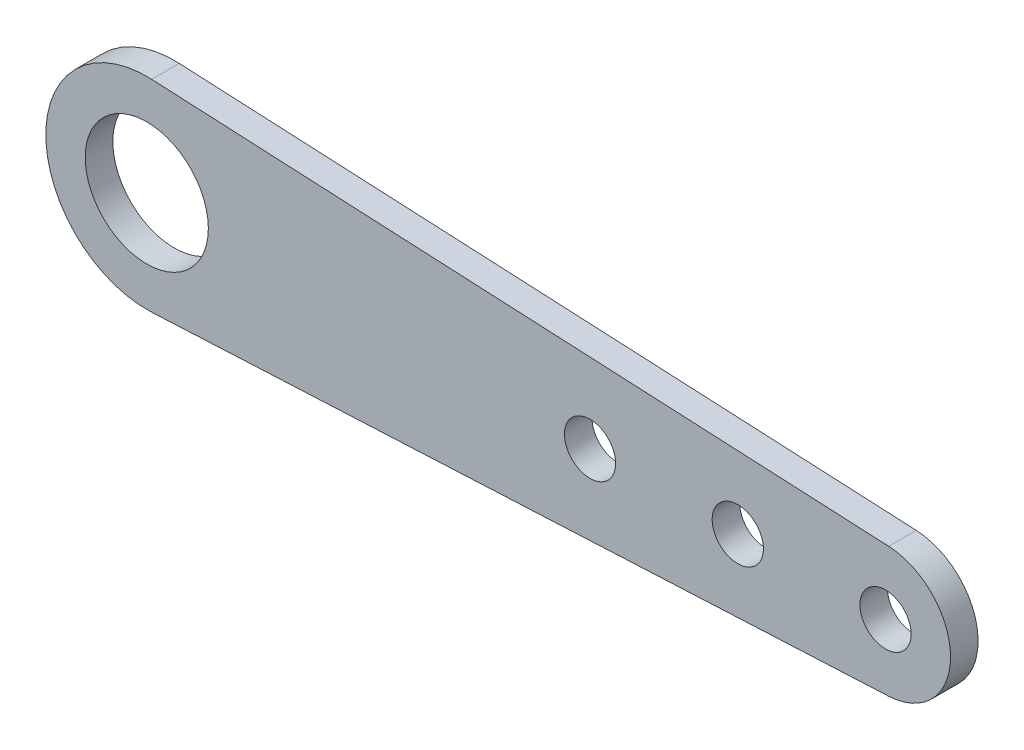
ISO-10303-21;
HEADER;
FILE_DESCRIPTION(('STEP AP214'),'2;1');
FILE_NAME('part.step','',(''),(''),'','','');
FILE_SCHEMA(('AUTOMOTIVE_DESIGN { 1 0 10303 214 1 1 1 1 }'));
ENDSEC;
DATA;
#1=APPLICATION_CONTEXT('core data for automotive mechanical design processes');
#2=APPLICATION_PROTOCOL_DEFINITION('international standard','automotive_design',2000,#1);
#3=PRODUCT_CONTEXT('',#1,'mechanical');
#4=PRODUCT('Part','Part','',(#3));
#5=PRODUCT_RELATED_PRODUCT_CATEGORY('part','',(#4));
#6=PRODUCT_DEFINITION_FORMATION('','',#4);
#7=PRODUCT_DEFINITION_CONTEXT('part definition',#1,'design');
#8=PRODUCT_DEFINITION('design','',#6,#7);
#9=PRODUCT_DEFINITION_SHAPE('','',#8);
#10=(LENGTH_UNIT() NAMED_UNIT(*) SI_UNIT(.MILLI.,.METRE.));
#11=(NAMED_UNIT(*) PLANE_ANGLE_UNIT() SI_UNIT($,.RADIAN.));
#12=(NAMED_UNIT(*) SI_UNIT($,.STERADIAN.) SOLID_ANGLE_UNIT());
#13=UNCERTAINTY_MEASURE_WITH_UNIT(LENGTH_MEASURE(1.E-05),#10,'distance_accuracy_value','');
#14=(GEOMETRIC_REPRESENTATION_CONTEXT(3) GLOBAL_UNCERTAINTY_ASSIGNED_CONTEXT((#13)) GLOBAL_UNIT_ASSIGNED_CONTEXT((#10,
#11,#12)) REPRESENTATION_CONTEXT('',''));
#15=CARTESIAN_POINT('',(0.,0.,0.));
#16=DIRECTION('',(0.,0.,1.));
#17=DIRECTION('',(1.,0.,0.));
#18=AXIS2_PLACEMENT_3D('',#15,#16,#17);
#19=CARTESIAN_POINT('',(0.,0.,3.556));
#20=DIRECTION('',(0.,0.,1.));
#21=DIRECTION('',(1.,0.,0.));
#22=AXIS2_PLACEMENT_3D('',#19,#20,#21);
#23=PLANE('',#22);
#24=CARTESIAN_POINT('',(76.2,0.,3.556));
#25=DIRECTION('',(0.,0.,1.));
#26=DIRECTION('',(1.,0.,0.));
#27=AXIS2_PLACEMENT_3D('',#24,#25,#26);
#28=CIRCLE('',#27,3.302);
#29=CARTESIAN_POINT('',(79.502,0.,3.556));
#30=VERTEX_POINT('',#29);
#31=EDGE_CURVE('E148',#30,#30,#28,.T.);
#32=ORIENTED_EDGE('',*,*,#31,.F.);
#33=EDGE_LOOP('',(#32));
#34=FACE_BOUND('',#33,.T.);
#35=CARTESIAN_POINT('',(0.,0.,3.556));
#36=DIRECTION('',(0.,0.,1.));
#37=DIRECTION('',(1.,0.,0.));
#38=AXIS2_PLACEMENT_3D('',#35,#36,#37);
#39=CIRCLE('',#38,7.9375);
#40=CARTESIAN_POINT('',(7.9375,0.,3.556));
#41=VERTEX_POINT('',#40);
#42=EDGE_CURVE('E118',#41,#41,#39,.T.);
#43=ORIENTED_EDGE('',*,*,#42,.F.);
#44=EDGE_LOOP('',(#43));
#45=FACE_BOUND('',#44,.T.);
#46=CARTESIAN_POINT('',(0.,0.,3.556));
#47=DIRECTION('',(0.,0.,1.));
#48=DIRECTION('',(1.,0.,0.));
#49=AXIS2_PLACEMENT_3D('',#46,#47,#48);
#50=CIRCLE('',#49,13.0175);
#51=CARTESIAN_POINT('',(0.633518333333333,13.0020752486413,3.556));
#52=VERTEX_POINT('',#51);
#53=CARTESIAN_POINT('',(0.633518333333333,-13.0020752486413,3.556));
#54=VERTEX_POINT('',#53);
#55=EDGE_CURVE('E98',#52,#54,#50,.T.);
#56=ORIENTED_EDGE('',*,*,#55,.T.);
#57=DIRECTION('',(0.998815075755045,0.0486666666666666,0.));
#58=VECTOR('',#57,1.);
#59=CARTESIAN_POINT('',(0.633518333333333,-13.0020752486413,3.556));
#60=LINE('',#59,#58);
#61=CARTESIAN_POINT('',(95.657924,-8.37206796497878,3.556));
#62=VERTEX_POINT('',#61);
#63=EDGE_CURVE('E93',#54,#62,#60,.T.);
#64=ORIENTED_EDGE('',*,*,#63,.T.);
#65=CARTESIAN_POINT('',(95.25,0.,3.556));
#66=DIRECTION('',(0.,0.,1.));
#67=DIRECTION('',(1.,0.,0.));
#68=AXIS2_PLACEMENT_3D('',#65,#66,#67);
#69=CIRCLE('',#68,8.382);
#70=CARTESIAN_POINT('',(95.657924,8.37206796497878,3.556));
#71=VERTEX_POINT('',#70);
#72=EDGE_CURVE('E96',#62,#71,#69,.T.);
#73=ORIENTED_EDGE('',*,*,#72,.T.);
#74=DIRECTION('',(-0.998815075755045,0.0486666666666666,0.));
#75=VECTOR('',#74,1.);
#76=CARTESIAN_POINT('',(0.633518333333333,13.0020752486413,3.556));
#77=LINE('',#76,#75);
#78=EDGE_CURVE('E63',#71,#52,#77,.T.);
#79=ORIENTED_EDGE('',*,*,#78,.T.);
#80=EDGE_LOOP('',(#56,#64,#73,#79));
#81=FACE_BOUND('',#80,.T.);
#82=CARTESIAN_POINT('',(57.15,0.,3.556));
#83=DIRECTION('',(0.,0.,1.));
#84=DIRECTION('',(1.,0.,0.));
#85=AXIS2_PLACEMENT_3D('',#82,#83,#84);
#86=CIRCLE('',#85,3.302);
#87=CARTESIAN_POINT('',(60.452,0.,3.556));
#88=VERTEX_POINT('',#87);
#89=EDGE_CURVE('E140',#88,#88,#86,.T.);
#90=ORIENTED_EDGE('',*,*,#89,.F.);
#91=EDGE_LOOP('',(#90));
#92=FACE_BOUND('',#91,.T.);
#93=CARTESIAN_POINT('',(95.25,0.,3.556));
#94=DIRECTION('',(0.,0.,1.));
#95=DIRECTION('',(1.,0.,0.));
#96=AXIS2_PLACEMENT_3D('',#93,#94,#95);
#97=CIRCLE('',#96,3.30200000000001);
#98=CARTESIAN_POINT('',(98.552,0.,3.556));
#99=VERTEX_POINT('',#98);
#100=EDGE_CURVE('E156',#99,#99,#97,.T.);
#101=ORIENTED_EDGE('',*,*,#100,.F.);
#102=EDGE_LOOP('',(#101));
#103=FACE_BOUND('',#102,.T.);
#104=ADVANCED_FACE('F45',(#34,#45,#81,#92,#103),#23,.T.);
#105=CARTESIAN_POINT('',(0.,0.,0.));
#106=DIRECTION('',(0.,0.,1.));
#107=DIRECTION('',(1.,0.,0.));
#108=AXIS2_PLACEMENT_3D('',#105,#106,#107);
#109=PLANE('',#108);
#110=CARTESIAN_POINT('',(0.,0.,0.));
#111=DIRECTION('',(0.,0.,1.));
#112=DIRECTION('',(1.,0.,0.));
#113=AXIS2_PLACEMENT_3D('',#110,#111,#112);
#114=CIRCLE('',#113,13.0175);
#115=CARTESIAN_POINT('',(0.633518333333333,13.0020752486413,0.));
#116=VERTEX_POINT('',#115);
#117=CARTESIAN_POINT('',(0.633518333333333,-13.0020752486413,0.));
#118=VERTEX_POINT('',#117);
#119=EDGE_CURVE('E114',#116,#118,#114,.T.);
#120=ORIENTED_EDGE('',*,*,#119,.F.);
#121=DIRECTION('',(-0.998815075755045,0.0486666666666666,0.));
#122=VECTOR('',#121,1.);
#123=CARTESIAN_POINT('',(0.633518333333333,13.0020752486413,0.));
#124=LINE('',#123,#122);
#125=CARTESIAN_POINT('',(95.657924,8.37206796497878,0.));
#126=VERTEX_POINT('',#125);
#127=EDGE_CURVE('E86',#126,#116,#124,.T.);
#128=ORIENTED_EDGE('',*,*,#127,.F.);
#129=CARTESIAN_POINT('',(95.25,0.,0.));
#130=DIRECTION('',(0.,0.,1.));
#131=DIRECTION('',(1.,0.,0.));
#132=AXIS2_PLACEMENT_3D('',#129,#130,#131);
#133=CIRCLE('',#132,8.382);
#134=CARTESIAN_POINT('',(95.657924,-8.37206796497878,0.));
#135=VERTEX_POINT('',#134);
#136=EDGE_CURVE('E80',#135,#126,#133,.T.);
#137=ORIENTED_EDGE('',*,*,#136,.F.);
#138=DIRECTION('',(0.998815075755045,0.0486666666666666,0.));
#139=VECTOR('',#138,1.);
#140=CARTESIAN_POINT('',(0.633518333333333,-13.0020752486413,0.));
#141=LINE('',#140,#139);
#142=EDGE_CURVE('E103',#118,#135,#141,.T.);
#143=ORIENTED_EDGE('',*,*,#142,.F.);
#144=EDGE_LOOP('',(#120,#128,#137,#143));
#145=FACE_BOUND('',#144,.T.);
#146=CARTESIAN_POINT('',(0.,0.,0.));
#147=DIRECTION('',(0.,0.,1.));
#148=DIRECTION('',(1.,0.,0.));
#149=AXIS2_PLACEMENT_3D('',#146,#147,#148);
#150=CIRCLE('',#149,7.9375);
#151=CARTESIAN_POINT('',(7.9375,0.,0.));
#152=VERTEX_POINT('',#151);
#153=EDGE_CURVE('E136',#152,#152,#150,.T.);
#154=ORIENTED_EDGE('',*,*,#153,.T.);
#155=EDGE_LOOP('',(#154));
#156=FACE_BOUND('',#155,.T.);
#157=CARTESIAN_POINT('',(57.15,0.,0.));
#158=DIRECTION('',(0.,0.,1.));
#159=DIRECTION('',(1.,0.,0.));
#160=AXIS2_PLACEMENT_3D('',#157,#158,#159);
#161=CIRCLE('',#160,3.302);
#162=CARTESIAN_POINT('',(60.452,0.,0.));
#163=VERTEX_POINT('',#162);
#164=EDGE_CURVE('E144',#163,#163,#161,.T.);
#165=ORIENTED_EDGE('',*,*,#164,.T.);
#166=EDGE_LOOP('',(#165));
#167=FACE_BOUND('',#166,.T.);
#168=CARTESIAN_POINT('',(76.2,0.,0.));
#169=DIRECTION('',(0.,0.,1.));
#170=DIRECTION('',(1.,0.,0.));
#171=AXIS2_PLACEMENT_3D('',#168,#169,#170);
#172=CIRCLE('',#171,3.302);
#173=CARTESIAN_POINT('',(79.502,0.,0.));
#174=VERTEX_POINT('',#173);
#175=EDGE_CURVE('E152',#174,#174,#172,.T.);
#176=ORIENTED_EDGE('',*,*,#175,.T.);
#177=EDGE_LOOP('',(#176));
#178=FACE_BOUND('',#177,.T.);
#179=CARTESIAN_POINT('',(95.25,0.,0.));
#180=DIRECTION('',(0.,0.,1.));
#181=DIRECTION('',(1.,0.,0.));
#182=AXIS2_PLACEMENT_3D('',#179,#180,#181);
#183=CIRCLE('',#182,3.30200000000001);
#184=CARTESIAN_POINT('',(98.552,0.,0.));
#185=VERTEX_POINT('',#184);
#186=EDGE_CURVE('E160',#185,#185,#183,.T.);
#187=ORIENTED_EDGE('',*,*,#186,.T.);
#188=EDGE_LOOP('',(#187));
#189=FACE_BOUND('',#188,.T.);
#190=ADVANCED_FACE('F131',(#145,#156,#167,#178,#189),#109,.F.);
#191=CARTESIAN_POINT('',(0.,0.,3.556));
#192=DIRECTION('',(0.,0.,-1.));
#193=DIRECTION('',(-1.,0.,0.));
#194=AXIS2_PLACEMENT_3D('',#191,#192,#193);
#195=CYLINDRICAL_SURFACE('',#194,13.0175);
#196=ORIENTED_EDGE('',*,*,#119,.T.);
#197=DIRECTION('',(0.,0.,-1.));
#198=VECTOR('',#197,1.);
#199=CARTESIAN_POINT('',(0.633518333333333,-13.0020752486413,3.556));
#200=LINE('',#199,#198);
#201=EDGE_CURVE('E11',#54,#118,#200,.T.);
#202=ORIENTED_EDGE('',*,*,#201,.F.);
#203=ORIENTED_EDGE('',*,*,#55,.F.);
#204=DIRECTION('',(0.,0.,-1.));
#205=VECTOR('',#204,1.);
#206=CARTESIAN_POINT('',(0.633518333333333,13.0020752486413,3.556));
#207=LINE('',#206,#205);
#208=EDGE_CURVE('E110',#52,#116,#207,.T.);
#209=ORIENTED_EDGE('',*,*,#208,.T.);
#210=EDGE_LOOP('',(#196,#202,#203,#209));
#211=FACE_BOUND('',#210,.T.);
#212=ADVANCED_FACE('F47',(#211),#195,.T.);
#213=CARTESIAN_POINT('',(0.633518333333333,-13.0020752486413,3.556));
#214=DIRECTION('',(-0.0486666666666666,0.998815075755045,0.));
#215=DIRECTION('',(-0.998815075755045,-0.0486666666666666,0.));
#216=AXIS2_PLACEMENT_3D('',#213,#214,#215);
#217=PLANE('',#216);
#218=ORIENTED_EDGE('',*,*,#142,.T.);
#219=DIRECTION('',(0.,0.,-1.));
#220=VECTOR('',#219,1.);
#221=CARTESIAN_POINT('',(95.657924,-8.37206796497878,3.556));
#222=LINE('',#221,#220);
#223=EDGE_CURVE('E55',#62,#135,#222,.T.);
#224=ORIENTED_EDGE('',*,*,#223,.F.);
#225=ORIENTED_EDGE('',*,*,#63,.F.);
#226=ORIENTED_EDGE('',*,*,#201,.T.);
#227=EDGE_LOOP('',(#218,#224,#225,#226));
#228=FACE_BOUND('',#227,.T.);
#229=ADVANCED_FACE('F102',(#228),#217,.F.);
#230=CARTESIAN_POINT('',(95.25,0.,3.556));
#231=DIRECTION('',(0.,0.,-1.));
#232=DIRECTION('',(-1.,0.,0.));
#233=AXIS2_PLACEMENT_3D('',#230,#231,#232);
#234=CYLINDRICAL_SURFACE('',#233,8.382);
#235=ORIENTED_EDGE('',*,*,#136,.T.);
#236=DIRECTION('',(0.,0.,-1.));
#237=VECTOR('',#236,1.);
#238=CARTESIAN_POINT('',(95.657924,8.37206796497878,3.556));
#239=LINE('',#238,#237);
#240=EDGE_CURVE('E105',#71,#126,#239,.T.);
#241=ORIENTED_EDGE('',*,*,#240,.F.);
#242=ORIENTED_EDGE('',*,*,#72,.F.);
#243=ORIENTED_EDGE('',*,*,#223,.T.);
#244=EDGE_LOOP('',(#235,#241,#242,#243));
#245=FACE_BOUND('',#244,.T.);
#246=ADVANCED_FACE('F106',(#245),#234,.T.);
#247=CARTESIAN_POINT('',(0.633518333333333,13.0020752486413,3.556));
#248=DIRECTION('',(-0.0486666666666666,-0.998815075755045,0.));
#249=DIRECTION('',(0.998815075755045,-0.0486666666666666,0.));
#250=AXIS2_PLACEMENT_3D('',#247,#248,#249);
#251=PLANE('',#250);
#252=ORIENTED_EDGE('',*,*,#127,.T.);
#253=ORIENTED_EDGE('',*,*,#208,.F.);
#254=ORIENTED_EDGE('',*,*,#78,.F.);
#255=ORIENTED_EDGE('',*,*,#240,.T.);
#256=EDGE_LOOP('',(#252,#253,#254,#255));
#257=FACE_BOUND('',#256,.T.);
#258=ADVANCED_FACE('F128',(#257),#251,.F.);
#259=CARTESIAN_POINT('',(0.,0.,3.556));
#260=DIRECTION('',(0.,0.,-1.));
#261=DIRECTION('',(-1.,0.,0.));
#262=AXIS2_PLACEMENT_3D('',#259,#260,#261);
#263=CYLINDRICAL_SURFACE('',#262,7.9375);
#264=ORIENTED_EDGE('',*,*,#42,.T.);
#265=EDGE_LOOP('',(#264));
#266=FACE_BOUND('',#265,.T.);
#267=ORIENTED_EDGE('',*,*,#153,.F.);
#268=EDGE_LOOP('',(#267));
#269=FACE_BOUND('',#268,.T.);
#270=ADVANCED_FACE('F181',(#266,#269),#263,.F.);
#271=CARTESIAN_POINT('',(57.15,0.,3.556));
#272=DIRECTION('',(0.,0.,-1.));
#273=DIRECTION('',(-1.,0.,0.));
#274=AXIS2_PLACEMENT_3D('',#271,#272,#273);
#275=CYLINDRICAL_SURFACE('',#274,3.302);
#276=ORIENTED_EDGE('',*,*,#89,.T.);
#277=EDGE_LOOP('',(#276));
#278=FACE_BOUND('',#277,.T.);
#279=ORIENTED_EDGE('',*,*,#164,.F.);
#280=EDGE_LOOP('',(#279));
#281=FACE_BOUND('',#280,.T.);
#282=ADVANCED_FACE('F226',(#278,#281),#275,.F.);
#283=CARTESIAN_POINT('',(76.2,0.,3.556));
#284=DIRECTION('',(0.,0.,-1.));
#285=DIRECTION('',(-1.,0.,0.));
#286=AXIS2_PLACEMENT_3D('',#283,#284,#285);
#287=CYLINDRICAL_SURFACE('',#286,3.302);
#288=ORIENTED_EDGE('',*,*,#31,.T.);
#289=EDGE_LOOP('',(#288));
#290=FACE_BOUND('',#289,.T.);
#291=ORIENTED_EDGE('',*,*,#175,.F.);
#292=EDGE_LOOP('',(#291));
#293=FACE_BOUND('',#292,.T.);
#294=ADVANCED_FACE('F234',(#290,#293),#287,.F.);
#295=CARTESIAN_POINT('',(95.25,0.,3.556));
#296=DIRECTION('',(0.,0.,-1.));
#297=DIRECTION('',(-1.,0.,0.));
#298=AXIS2_PLACEMENT_3D('',#295,#296,#297);
#299=CYLINDRICAL_SURFACE('',#298,3.30200000000001);
#300=ORIENTED_EDGE('',*,*,#100,.T.);
#301=EDGE_LOOP('',(#300));
#302=FACE_BOUND('',#301,.T.);
#303=ORIENTED_EDGE('',*,*,#186,.F.);
#304=EDGE_LOOP('',(#303));
#305=FACE_BOUND('',#304,.T.);
#306=ADVANCED_FACE('F168',(#302,#305),#299,.F.);
#307=CLOSED_SHELL('',(#104,#190,#212,#229,#246,#258,#270,#282,#294,#306));
#308=MANIFOLD_SOLID_BREP('B2',#307);
#309=ADVANCED_BREP_SHAPE_REPRESENTATION('',(#18,#308),#14);
#310=SHAPE_DEFINITION_REPRESENTATION(#9,#309);
ENDSEC;
END-ISO-10303-21;
